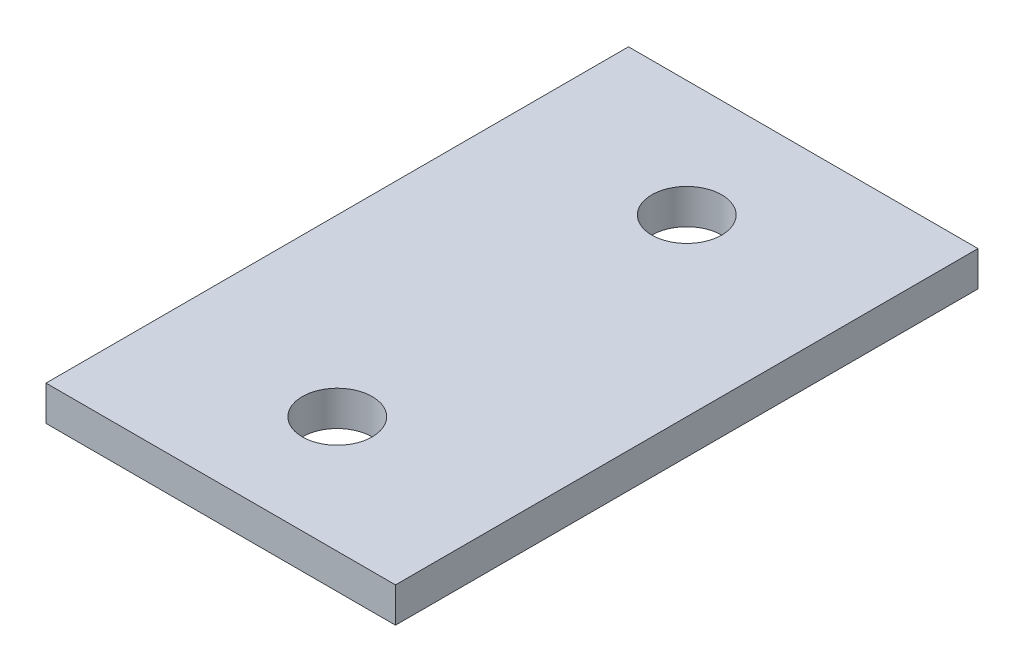
ISO-10303-21;
HEADER;
FILE_DESCRIPTION(('STEP AP214'),'2;1');
FILE_NAME('part.step','',(''),(''),'','','');
FILE_SCHEMA(('AUTOMOTIVE_DESIGN { 1 0 10303 214 1 1 1 1 }'));
ENDSEC;
DATA;
#1=APPLICATION_CONTEXT('core data for automotive mechanical design processes');
#2=APPLICATION_PROTOCOL_DEFINITION('international standard','automotive_design',2000,#1);
#3=PRODUCT_CONTEXT('',#1,'mechanical');
#4=PRODUCT('Part','Part','',(#3));
#5=PRODUCT_RELATED_PRODUCT_CATEGORY('part','',(#4));
#6=PRODUCT_DEFINITION_FORMATION('','',#4);
#7=PRODUCT_DEFINITION_CONTEXT('part definition',#1,'design');
#8=PRODUCT_DEFINITION('design','',#6,#7);
#9=PRODUCT_DEFINITION_SHAPE('','',#8);
#10=(LENGTH_UNIT() NAMED_UNIT(*) SI_UNIT(.MILLI.,.METRE.));
#11=(NAMED_UNIT(*) PLANE_ANGLE_UNIT() SI_UNIT($,.RADIAN.));
#12=(NAMED_UNIT(*) SI_UNIT($,.STERADIAN.) SOLID_ANGLE_UNIT());
#13=UNCERTAINTY_MEASURE_WITH_UNIT(LENGTH_MEASURE(1.E-05),#10,'distance_accuracy_value','');
#14=(GEOMETRIC_REPRESENTATION_CONTEXT(3) GLOBAL_UNCERTAINTY_ASSIGNED_CONTEXT((#13)) GLOBAL_UNIT_ASSIGNED_CONTEXT((#10,
#11,#12)) REPRESENTATION_CONTEXT('',''));
#15=CARTESIAN_POINT('',(0.,0.,0.));
#16=DIRECTION('',(0.,0.,1.));
#17=DIRECTION('',(1.,0.,0.));
#18=AXIS2_PLACEMENT_3D('',#15,#16,#17);
#19=CARTESIAN_POINT('',(7.5,2.,-12.5));
#20=DIRECTION('',(-1.,0.,0.));
#21=DIRECTION('',(0.,0.,1.));
#22=AXIS2_PLACEMENT_3D('',#19,#20,#21);
#23=PLANE('',#22);
#24=DIRECTION('',(0.,0.,-1.));
#25=VECTOR('',#24,1.);
#26=CARTESIAN_POINT('',(7.5,1.5,-12.5));
#27=LINE('',#26,#25);
#28=CARTESIAN_POINT('',(7.5,1.5,12.5));
#29=VERTEX_POINT('',#28);
#30=CARTESIAN_POINT('',(7.5,1.5,-12.5));
#31=VERTEX_POINT('',#30);
#32=EDGE_CURVE('E74',#29,#31,#27,.T.);
#33=ORIENTED_EDGE('',*,*,#32,.F.);
#34=DIRECTION('',(0.,-1.,0.));
#35=VECTOR('',#34,1.);
#36=CARTESIAN_POINT('',(7.5,2.,12.5));
#37=LINE('',#36,#35);
#38=CARTESIAN_POINT('',(7.5,0.,12.5));
#39=VERTEX_POINT('',#38);
#40=EDGE_CURVE('E56',#29,#39,#37,.T.);
#41=ORIENTED_EDGE('',*,*,#40,.T.);
#42=DIRECTION('',(0.,0.,-1.));
#43=VECTOR('',#42,1.);
#44=CARTESIAN_POINT('',(7.5,0.,-12.5));
#45=LINE('',#44,#43);
#46=CARTESIAN_POINT('',(7.5,0.,-12.5));
#47=VERTEX_POINT('',#46);
#48=EDGE_CURVE('E106',#39,#47,#45,.T.);
#49=ORIENTED_EDGE('',*,*,#48,.T.);
#50=DIRECTION('',(0.,-1.,0.));
#51=VECTOR('',#50,1.);
#52=CARTESIAN_POINT('',(7.5,2.,-12.5));
#53=LINE('',#52,#51);
#54=EDGE_CURVE('E11',#31,#47,#53,.T.);
#55=ORIENTED_EDGE('',*,*,#54,.F.);
#56=EDGE_LOOP('',(#33,#41,#49,#55));
#57=FACE_BOUND('',#56,.T.);
#58=ADVANCED_FACE('F33',(#57),#23,.F.);
#59=CARTESIAN_POINT('',(-7.5,2.,-12.5));
#60=DIRECTION('',(0.,0.,1.));
#61=DIRECTION('',(1.,0.,0.));
#62=AXIS2_PLACEMENT_3D('',#59,#60,#61);
#63=PLANE('',#62);
#64=DIRECTION('',(-1.,0.,0.));
#65=VECTOR('',#64,1.);
#66=CARTESIAN_POINT('',(-7.5,1.5,-12.5));
#67=LINE('',#66,#65);
#68=CARTESIAN_POINT('',(-7.5,1.5,-12.5));
#69=VERTEX_POINT('',#68);
#70=EDGE_CURVE('E82',#31,#69,#67,.T.);
#71=ORIENTED_EDGE('',*,*,#70,.F.);
#72=ORIENTED_EDGE('',*,*,#54,.T.);
#73=DIRECTION('',(-1.,0.,0.));
#74=VECTOR('',#73,1.);
#75=CARTESIAN_POINT('',(-7.5,0.,-12.5));
#76=LINE('',#75,#74);
#77=CARTESIAN_POINT('',(-7.5,0.,-12.5));
#78=VERTEX_POINT('',#77);
#79=EDGE_CURVE('E103',#47,#78,#76,.T.);
#80=ORIENTED_EDGE('',*,*,#79,.T.);
#81=DIRECTION('',(0.,-1.,0.));
#82=VECTOR('',#81,1.);
#83=CARTESIAN_POINT('',(-7.5,2.,-12.5));
#84=LINE('',#83,#82);
#85=EDGE_CURVE('E41',#69,#78,#84,.T.);
#86=ORIENTED_EDGE('',*,*,#85,.F.);
#87=EDGE_LOOP('',(#71,#72,#80,#86));
#88=FACE_BOUND('',#87,.T.);
#89=ADVANCED_FACE('F104',(#88),#63,.F.);
#90=CARTESIAN_POINT('',(-7.5,2.,-12.5));
#91=DIRECTION('',(1.,0.,0.));
#92=DIRECTION('',(0.,0.,-1.));
#93=AXIS2_PLACEMENT_3D('',#90,#91,#92);
#94=PLANE('',#93);
#95=DIRECTION('',(0.,0.,1.));
#96=VECTOR('',#95,1.);
#97=CARTESIAN_POINT('',(-7.5,1.5,-12.5));
#98=LINE('',#97,#96);
#99=CARTESIAN_POINT('',(-7.5,1.5,12.5));
#100=VERTEX_POINT('',#99);
#101=EDGE_CURVE('E48',#69,#100,#98,.T.);
#102=ORIENTED_EDGE('',*,*,#101,.F.);
#103=ORIENTED_EDGE('',*,*,#85,.T.);
#104=DIRECTION('',(0.,0.,1.));
#105=VECTOR('',#104,1.);
#106=CARTESIAN_POINT('',(-7.5,0.,-12.5));
#107=LINE('',#106,#105);
#108=CARTESIAN_POINT('',(-7.5,0.,12.5));
#109=VERTEX_POINT('',#108);
#110=EDGE_CURVE('E91',#78,#109,#107,.T.);
#111=ORIENTED_EDGE('',*,*,#110,.T.);
#112=DIRECTION('',(0.,-1.,0.));
#113=VECTOR('',#112,1.);
#114=CARTESIAN_POINT('',(-7.5,2.,12.5));
#115=LINE('',#114,#113);
#116=EDGE_CURVE('E88',#100,#109,#115,.T.);
#117=ORIENTED_EDGE('',*,*,#116,.F.);
#118=EDGE_LOOP('',(#102,#103,#111,#117));
#119=FACE_BOUND('',#118,.T.);
#120=ADVANCED_FACE('F99',(#119),#94,.F.);
#121=CARTESIAN_POINT('',(-7.5,2.,12.5));
#122=DIRECTION('',(0.,0.,-1.));
#123=DIRECTION('',(-1.,0.,0.));
#124=AXIS2_PLACEMENT_3D('',#121,#122,#123);
#125=PLANE('',#124);
#126=DIRECTION('',(1.,0.,0.));
#127=VECTOR('',#126,1.);
#128=CARTESIAN_POINT('',(-7.5,1.5,12.5));
#129=LINE('',#128,#127);
#130=EDGE_CURVE('E72',#100,#29,#129,.T.);
#131=ORIENTED_EDGE('',*,*,#130,.F.);
#132=ORIENTED_EDGE('',*,*,#116,.T.);
#133=DIRECTION('',(1.,0.,0.));
#134=VECTOR('',#133,1.);
#135=CARTESIAN_POINT('',(-7.5,0.,12.5));
#136=LINE('',#135,#134);
#137=EDGE_CURVE('E86',#109,#39,#136,.T.);
#138=ORIENTED_EDGE('',*,*,#137,.T.);
#139=ORIENTED_EDGE('',*,*,#40,.F.);
#140=EDGE_LOOP('',(#131,#132,#138,#139));
#141=FACE_BOUND('',#140,.T.);
#142=ADVANCED_FACE('F84',(#141),#125,.F.);
#143=CARTESIAN_POINT('',(0.,0.,-7.5));
#144=DIRECTION('',(0.,1.,0.));
#145=DIRECTION('',(0.,0.,1.));
#146=AXIS2_PLACEMENT_3D('',#143,#144,#145);
#147=CYLINDRICAL_SURFACE('',#146,1.5);
#148=CARTESIAN_POINT('',(0.,0.,-7.5));
#149=DIRECTION('',(0.,1.,0.));
#150=DIRECTION('',(0.,0.,1.));
#151=AXIS2_PLACEMENT_3D('',#148,#149,#150);
#152=CIRCLE('',#151,1.5);
#153=CARTESIAN_POINT('',(0.,0.,-6.));
#154=VERTEX_POINT('',#153);
#155=EDGE_CURVE('E111',#154,#154,#152,.T.);
#156=ORIENTED_EDGE('',*,*,#155,.F.);
#157=EDGE_LOOP('',(#156));
#158=FACE_BOUND('',#157,.T.);
#159=CARTESIAN_POINT('',(0.,1.5,-7.5));
#160=DIRECTION('',(0.,1.,0.));
#161=DIRECTION('',(0.,0.,1.));
#162=AXIS2_PLACEMENT_3D('',#159,#160,#161);
#163=CIRCLE('',#162,1.5);
#164=CARTESIAN_POINT('',(0.,1.5,-6.));
#165=VERTEX_POINT('',#164);
#166=EDGE_CURVE('E78',#165,#165,#163,.F.);
#167=ORIENTED_EDGE('',*,*,#166,.F.);
#168=EDGE_LOOP('',(#167));
#169=FACE_BOUND('',#168,.T.);
#170=ADVANCED_FACE('F127',(#158,#169),#147,.F.);
#171=CARTESIAN_POINT('',(0.,0.,7.5));
#172=DIRECTION('',(0.,1.,0.));
#173=DIRECTION('',(0.,0.,1.));
#174=AXIS2_PLACEMENT_3D('',#171,#172,#173);
#175=CYLINDRICAL_SURFACE('',#174,1.5);
#176=CARTESIAN_POINT('',(0.,0.,7.5));
#177=DIRECTION('',(0.,1.,0.));
#178=DIRECTION('',(0.,0.,1.));
#179=AXIS2_PLACEMENT_3D('',#176,#177,#178);
#180=CIRCLE('',#179,1.5);
#181=CARTESIAN_POINT('',(0.,0.,9.));
#182=VERTEX_POINT('',#181);
#183=EDGE_CURVE('E81',#182,#182,#180,.T.);
#184=ORIENTED_EDGE('',*,*,#183,.F.);
#185=EDGE_LOOP('',(#184));
#186=FACE_BOUND('',#185,.T.);
#187=CARTESIAN_POINT('',(0.,1.5,7.5));
#188=DIRECTION('',(0.,1.,0.));
#189=DIRECTION('',(0.,0.,1.));
#190=AXIS2_PLACEMENT_3D('',#187,#188,#189);
#191=CIRCLE('',#190,1.5);
#192=CARTESIAN_POINT('',(0.,1.5,9.));
#193=VERTEX_POINT('',#192);
#194=EDGE_CURVE('E36',#193,#193,#191,.F.);
#195=ORIENTED_EDGE('',*,*,#194,.F.);
#196=EDGE_LOOP('',(#195));
#197=FACE_BOUND('',#196,.T.);
#198=ADVANCED_FACE('F125',(#186,#197),#175,.F.);
#199=CARTESIAN_POINT('',(0.,0.,0.));
#200=DIRECTION('',(0.,1.,0.));
#201=DIRECTION('',(0.,0.,1.));
#202=AXIS2_PLACEMENT_3D('',#199,#200,#201);
#203=PLANE('',#202);
#204=ORIENTED_EDGE('',*,*,#183,.T.);
#205=EDGE_LOOP('',(#204));
#206=FACE_BOUND('',#205,.T.);
#207=ORIENTED_EDGE('',*,*,#155,.T.);
#208=EDGE_LOOP('',(#207));
#209=FACE_BOUND('',#208,.T.);
#210=ORIENTED_EDGE('',*,*,#48,.F.);
#211=ORIENTED_EDGE('',*,*,#137,.F.);
#212=ORIENTED_EDGE('',*,*,#110,.F.);
#213=ORIENTED_EDGE('',*,*,#79,.F.);
#214=EDGE_LOOP('',(#210,#211,#212,#213));
#215=FACE_BOUND('',#214,.T.);
#216=ADVANCED_FACE('F108',(#206,#209,#215),#203,.F.);
#217=CARTESIAN_POINT('',(0.,1.5,0.));
#218=DIRECTION('',(0.,1.,0.));
#219=DIRECTION('',(0.,0.,1.));
#220=AXIS2_PLACEMENT_3D('',#217,#218,#219);
#221=PLANE('',#220);
#222=ORIENTED_EDGE('',*,*,#166,.T.);
#223=EDGE_LOOP('',(#222));
#224=FACE_BOUND('',#223,.T.);
#225=ORIENTED_EDGE('',*,*,#194,.T.);
#226=EDGE_LOOP('',(#225));
#227=FACE_BOUND('',#226,.T.);
#228=ORIENTED_EDGE('',*,*,#32,.T.);
#229=ORIENTED_EDGE('',*,*,#70,.T.);
#230=ORIENTED_EDGE('',*,*,#101,.T.);
#231=ORIENTED_EDGE('',*,*,#130,.T.);
#232=EDGE_LOOP('',(#228,#229,#230,#231));
#233=FACE_BOUND('',#232,.T.);
#234=ADVANCED_FACE('F73',(#224,#227,#233),#221,.T.);
#235=CLOSED_SHELL('',(#58,#89,#120,#142,#170,#198,#216,#234));
#236=MANIFOLD_SOLID_BREP('B2',#235);
#237=ADVANCED_BREP_SHAPE_REPRESENTATION('',(#18,#236),#14);
#238=SHAPE_DEFINITION_REPRESENTATION(#9,#237);
ENDSEC;
END-ISO-10303-21;
